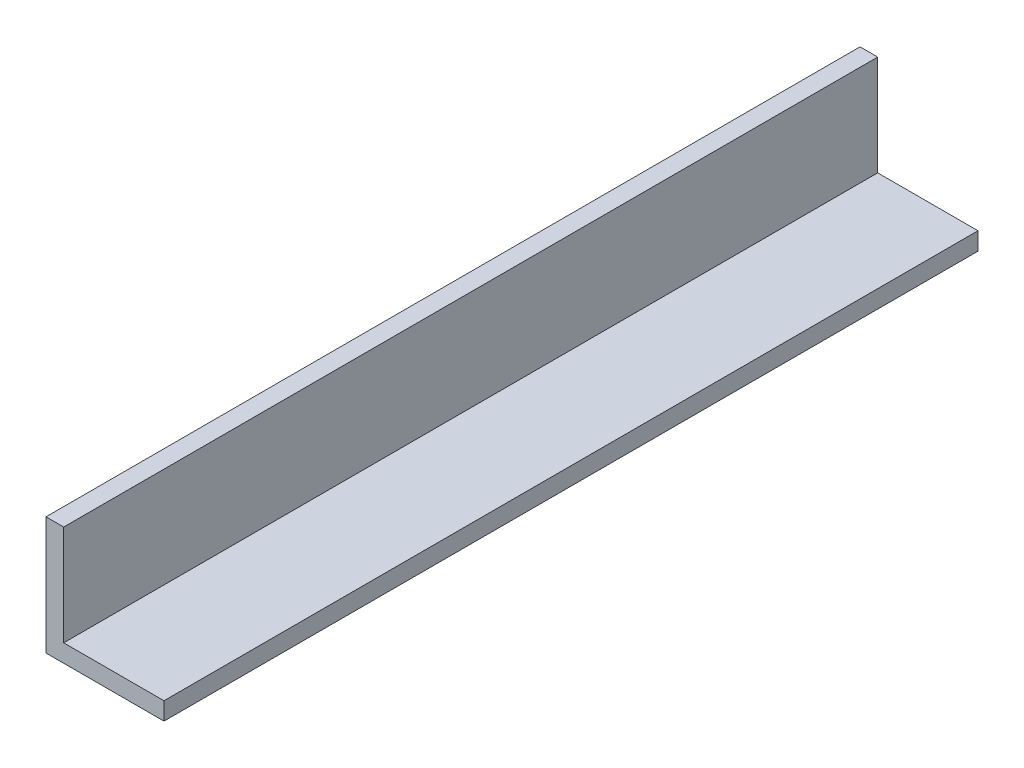
ISO-10303-21;
HEADER;
FILE_DESCRIPTION(('STEP AP214'),'2;1');
FILE_NAME('part.step','',(''),(''),'','','');
FILE_SCHEMA(('AUTOMOTIVE_DESIGN { 1 0 10303 214 1 1 1 1 }'));
ENDSEC;
DATA;
#1=APPLICATION_CONTEXT('core data for automotive mechanical design processes');
#2=APPLICATION_PROTOCOL_DEFINITION('international standard','automotive_design',2000,#1);
#3=PRODUCT_CONTEXT('',#1,'mechanical');
#4=PRODUCT('Part','Part','',(#3));
#5=PRODUCT_RELATED_PRODUCT_CATEGORY('part','',(#4));
#6=PRODUCT_DEFINITION_FORMATION('','',#4);
#7=PRODUCT_DEFINITION_CONTEXT('part definition',#1,'design');
#8=PRODUCT_DEFINITION('design','',#6,#7);
#9=PRODUCT_DEFINITION_SHAPE('','',#8);
#10=(LENGTH_UNIT() NAMED_UNIT(*) SI_UNIT(.MILLI.,.METRE.));
#11=(NAMED_UNIT(*) PLANE_ANGLE_UNIT() SI_UNIT($,.RADIAN.));
#12=(NAMED_UNIT(*) SI_UNIT($,.STERADIAN.) SOLID_ANGLE_UNIT());
#13=UNCERTAINTY_MEASURE_WITH_UNIT(LENGTH_MEASURE(1.E-05),#10,'distance_accuracy_value','');
#14=(GEOMETRIC_REPRESENTATION_CONTEXT(3) GLOBAL_UNCERTAINTY_ASSIGNED_CONTEXT((#13)) GLOBAL_UNIT_ASSIGNED_CONTEXT((#10,
#11,#12)) REPRESENTATION_CONTEXT('',''));
#15=CARTESIAN_POINT('',(0.,0.,0.));
#16=DIRECTION('',(0.,0.,1.));
#17=DIRECTION('',(1.,0.,0.));
#18=AXIS2_PLACEMENT_3D('',#15,#16,#17);
#19=CARTESIAN_POINT('',(20.,0.,138.));
#20=DIRECTION('',(-1.,0.,0.));
#21=DIRECTION('',(0.,0.,1.));
#22=AXIS2_PLACEMENT_3D('',#19,#20,#21);
#23=PLANE('',#22);
#24=DIRECTION('',(0.,1.,0.));
#25=VECTOR('',#24,1.);
#26=CARTESIAN_POINT('',(20.,0.,0.));
#27=LINE('',#26,#25);
#28=CARTESIAN_POINT('',(20.,0.,0.));
#29=VERTEX_POINT('',#28);
#30=CARTESIAN_POINT('',(20.,3.,0.));
#31=VERTEX_POINT('',#30);
#32=EDGE_CURVE('E128',#29,#31,#27,.T.);
#33=ORIENTED_EDGE('',*,*,#32,.T.);
#34=DIRECTION('',(0.,0.,-1.));
#35=VECTOR('',#34,1.);
#36=CARTESIAN_POINT('',(20.,3.,138.));
#37=LINE('',#36,#35);
#38=CARTESIAN_POINT('',(20.,3.,138.));
#39=VERTEX_POINT('',#38);
#40=EDGE_CURVE('E11',#39,#31,#37,.T.);
#41=ORIENTED_EDGE('',*,*,#40,.F.);
#42=DIRECTION('',(0.,1.,0.));
#43=VECTOR('',#42,1.);
#44=CARTESIAN_POINT('',(20.,0.,138.));
#45=LINE('',#44,#43);
#46=CARTESIAN_POINT('',(20.,0.,138.));
#47=VERTEX_POINT('',#46);
#48=EDGE_CURVE('E144',#47,#39,#45,.T.);
#49=ORIENTED_EDGE('',*,*,#48,.F.);
#50=DIRECTION('',(0.,0.,-1.));
#51=VECTOR('',#50,1.);
#52=CARTESIAN_POINT('',(20.,0.,138.));
#53=LINE('',#52,#51);
#54=EDGE_CURVE('E124',#47,#29,#53,.T.);
#55=ORIENTED_EDGE('',*,*,#54,.T.);
#56=EDGE_LOOP('',(#33,#41,#49,#55));
#57=FACE_BOUND('',#56,.T.);
#58=ADVANCED_FACE('F39',(#57),#23,.F.);
#59=CARTESIAN_POINT('',(20.,3.,138.));
#60=DIRECTION('',(0.,-1.,0.));
#61=DIRECTION('',(0.,0.,-1.));
#62=AXIS2_PLACEMENT_3D('',#59,#60,#61);
#63=PLANE('',#62);
#64=DIRECTION('',(-1.,0.,0.));
#65=VECTOR('',#64,1.);
#66=CARTESIAN_POINT('',(20.,3.,0.));
#67=LINE('',#66,#65);
#68=CARTESIAN_POINT('',(3.,3.,0.));
#69=VERTEX_POINT('',#68);
#70=EDGE_CURVE('E132',#31,#69,#67,.T.);
#71=ORIENTED_EDGE('',*,*,#70,.T.);
#72=DIRECTION('',(0.,0.,-1.));
#73=VECTOR('',#72,1.);
#74=CARTESIAN_POINT('',(3.,3.,138.));
#75=LINE('',#74,#73);
#76=CARTESIAN_POINT('',(3.,3.,138.));
#77=VERTEX_POINT('',#76);
#78=EDGE_CURVE('E48',#77,#69,#75,.T.);
#79=ORIENTED_EDGE('',*,*,#78,.F.);
#80=DIRECTION('',(-1.,0.,0.));
#81=VECTOR('',#80,1.);
#82=CARTESIAN_POINT('',(20.,3.,138.));
#83=LINE('',#82,#81);
#84=EDGE_CURVE('E93',#39,#77,#83,.T.);
#85=ORIENTED_EDGE('',*,*,#84,.F.);
#86=ORIENTED_EDGE('',*,*,#40,.T.);
#87=EDGE_LOOP('',(#71,#79,#85,#86));
#88=FACE_BOUND('',#87,.T.);
#89=ADVANCED_FACE('F172',(#88),#63,.F.);
#90=CARTESIAN_POINT('',(3.,20.,138.));
#91=DIRECTION('',(-1.,0.,0.));
#92=DIRECTION('',(0.,-1.,0.));
#93=AXIS2_PLACEMENT_3D('',#90,#91,#92);
#94=PLANE('',#93);
#95=DIRECTION('',(0.,1.,0.));
#96=VECTOR('',#95,1.);
#97=CARTESIAN_POINT('',(3.,20.,0.));
#98=LINE('',#97,#96);
#99=CARTESIAN_POINT('',(3.,20.,0.));
#100=VERTEX_POINT('',#99);
#101=EDGE_CURVE('E135',#69,#100,#98,.T.);
#102=ORIENTED_EDGE('',*,*,#101,.T.);
#103=DIRECTION('',(0.,0.,-1.));
#104=VECTOR('',#103,1.);
#105=CARTESIAN_POINT('',(3.,20.,138.));
#106=LINE('',#105,#104);
#107=CARTESIAN_POINT('',(3.,20.,138.));
#108=VERTEX_POINT('',#107);
#109=EDGE_CURVE('E117',#108,#100,#106,.T.);
#110=ORIENTED_EDGE('',*,*,#109,.F.);
#111=DIRECTION('',(0.,1.,0.));
#112=VECTOR('',#111,1.);
#113=CARTESIAN_POINT('',(3.,20.,138.));
#114=LINE('',#113,#112);
#115=EDGE_CURVE('E106',#77,#108,#114,.T.);
#116=ORIENTED_EDGE('',*,*,#115,.F.);
#117=ORIENTED_EDGE('',*,*,#78,.T.);
#118=EDGE_LOOP('',(#102,#110,#116,#117));
#119=FACE_BOUND('',#118,.T.);
#120=ADVANCED_FACE('F154',(#119),#94,.F.);
#121=CARTESIAN_POINT('',(0.,20.,138.));
#122=DIRECTION('',(0.,-1.,0.));
#123=DIRECTION('',(0.,0.,-1.));
#124=AXIS2_PLACEMENT_3D('',#121,#122,#123);
#125=PLANE('',#124);
#126=DIRECTION('',(-1.,0.,0.));
#127=VECTOR('',#126,1.);
#128=CARTESIAN_POINT('',(0.,20.,0.));
#129=LINE('',#128,#127);
#130=CARTESIAN_POINT('',(0.,20.,0.));
#131=VERTEX_POINT('',#130);
#132=EDGE_CURVE('E115',#100,#131,#129,.T.);
#133=ORIENTED_EDGE('',*,*,#132,.T.);
#134=DIRECTION('',(0.,0.,-1.));
#135=VECTOR('',#134,1.);
#136=CARTESIAN_POINT('',(0.,20.,138.));
#137=LINE('',#136,#135);
#138=CARTESIAN_POINT('',(0.,20.,138.));
#139=VERTEX_POINT('',#138);
#140=EDGE_CURVE('E112',#139,#131,#137,.T.);
#141=ORIENTED_EDGE('',*,*,#140,.F.);
#142=DIRECTION('',(-1.,0.,0.));
#143=VECTOR('',#142,1.);
#144=CARTESIAN_POINT('',(0.,20.,138.));
#145=LINE('',#144,#143);
#146=EDGE_CURVE('E100',#108,#139,#145,.T.);
#147=ORIENTED_EDGE('',*,*,#146,.F.);
#148=ORIENTED_EDGE('',*,*,#109,.T.);
#149=EDGE_LOOP('',(#133,#141,#147,#148));
#150=FACE_BOUND('',#149,.T.);
#151=ADVANCED_FACE('F113',(#150),#125,.F.);
#152=CARTESIAN_POINT('',(0.,0.,138.));
#153=DIRECTION('',(1.,0.,0.));
#154=DIRECTION('',(0.,0.,-1.));
#155=AXIS2_PLACEMENT_3D('',#152,#153,#154);
#156=PLANE('',#155);
#157=DIRECTION('',(0.,-1.,0.));
#158=VECTOR('',#157,1.);
#159=CARTESIAN_POINT('',(0.,0.,0.));
#160=LINE('',#159,#158);
#161=CARTESIAN_POINT('',(0.,0.,0.));
#162=VERTEX_POINT('',#161);
#163=EDGE_CURVE('E79',#131,#162,#160,.T.);
#164=ORIENTED_EDGE('',*,*,#163,.T.);
#165=DIRECTION('',(0.,0.,-1.));
#166=VECTOR('',#165,1.);
#167=CARTESIAN_POINT('',(0.,0.,138.));
#168=LINE('',#167,#166);
#169=CARTESIAN_POINT('',(0.,0.,138.));
#170=VERTEX_POINT('',#169);
#171=EDGE_CURVE('E118',#170,#162,#168,.T.);
#172=ORIENTED_EDGE('',*,*,#171,.F.);
#173=DIRECTION('',(0.,-1.,0.));
#174=VECTOR('',#173,1.);
#175=CARTESIAN_POINT('',(0.,0.,138.));
#176=LINE('',#175,#174);
#177=EDGE_CURVE('E104',#139,#170,#176,.T.);
#178=ORIENTED_EDGE('',*,*,#177,.F.);
#179=ORIENTED_EDGE('',*,*,#140,.T.);
#180=EDGE_LOOP('',(#164,#172,#178,#179));
#181=FACE_BOUND('',#180,.T.);
#182=ADVANCED_FACE('F120',(#181),#156,.F.);
#183=CARTESIAN_POINT('',(0.,0.,138.));
#184=DIRECTION('',(0.,1.,0.));
#185=DIRECTION('',(0.,0.,1.));
#186=AXIS2_PLACEMENT_3D('',#183,#184,#185);
#187=PLANE('',#186);
#188=DIRECTION('',(1.,0.,0.));
#189=VECTOR('',#188,1.);
#190=CARTESIAN_POINT('',(0.,0.,0.));
#191=LINE('',#190,#189);
#192=EDGE_CURVE('E85',#162,#29,#191,.T.);
#193=ORIENTED_EDGE('',*,*,#192,.T.);
#194=ORIENTED_EDGE('',*,*,#54,.F.);
#195=DIRECTION('',(1.,0.,0.));
#196=VECTOR('',#195,1.);
#197=CARTESIAN_POINT('',(0.,0.,138.));
#198=LINE('',#197,#196);
#199=EDGE_CURVE('E56',#170,#47,#198,.T.);
#200=ORIENTED_EDGE('',*,*,#199,.F.);
#201=ORIENTED_EDGE('',*,*,#171,.T.);
#202=EDGE_LOOP('',(#193,#194,#200,#201));
#203=FACE_BOUND('',#202,.T.);
#204=ADVANCED_FACE('F161',(#203),#187,.F.);
#205=CARTESIAN_POINT('',(0.,0.,138.));
#206=DIRECTION('',(0.,0.,1.));
#207=DIRECTION('',(1.,0.,0.));
#208=AXIS2_PLACEMENT_3D('',#205,#206,#207);
#209=PLANE('',#208);
#210=ORIENTED_EDGE('',*,*,#48,.T.);
#211=ORIENTED_EDGE('',*,*,#84,.T.);
#212=ORIENTED_EDGE('',*,*,#115,.T.);
#213=ORIENTED_EDGE('',*,*,#146,.T.);
#214=ORIENTED_EDGE('',*,*,#177,.T.);
#215=ORIENTED_EDGE('',*,*,#199,.T.);
#216=EDGE_LOOP('',(#210,#211,#212,#213,#214,#215));
#217=FACE_BOUND('',#216,.T.);
#218=ADVANCED_FACE('F102',(#217),#209,.T.);
#219=CARTESIAN_POINT('',(0.,0.,0.));
#220=DIRECTION('',(0.,0.,1.));
#221=DIRECTION('',(1.,0.,0.));
#222=AXIS2_PLACEMENT_3D('',#219,#220,#221);
#223=PLANE('',#222);
#224=ORIENTED_EDGE('',*,*,#32,.F.);
#225=ORIENTED_EDGE('',*,*,#192,.F.);
#226=ORIENTED_EDGE('',*,*,#163,.F.);
#227=ORIENTED_EDGE('',*,*,#132,.F.);
#228=ORIENTED_EDGE('',*,*,#101,.F.);
#229=ORIENTED_EDGE('',*,*,#70,.F.);
#230=EDGE_LOOP('',(#224,#225,#226,#227,#228,#229));
#231=FACE_BOUND('',#230,.T.);
#232=ADVANCED_FACE('F157',(#231),#223,.F.);
#233=CLOSED_SHELL('',(#58,#89,#120,#151,#182,#204,#218,#232));
#234=MANIFOLD_SOLID_BREP('B2',#233);
#235=ADVANCED_BREP_SHAPE_REPRESENTATION('',(#18,#234),#14);
#236=SHAPE_DEFINITION_REPRESENTATION(#9,#235);
ENDSEC;
END-ISO-10303-21;
